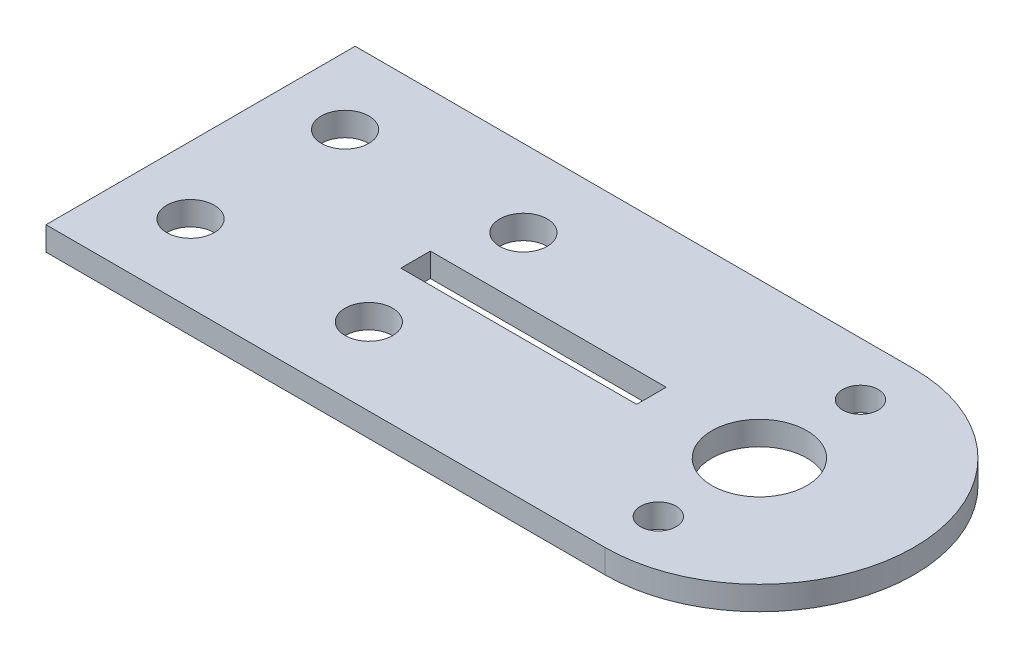
ISO-10303-21;
HEADER;
FILE_DESCRIPTION(('STEP AP214'),'2;1');
FILE_NAME('part.step','',(''),(''),'','','');
FILE_SCHEMA(('AUTOMOTIVE_DESIGN { 1 0 10303 214 1 1 1 1 }'));
ENDSEC;
DATA;
#1=APPLICATION_CONTEXT('core data for automotive mechanical design processes');
#2=APPLICATION_PROTOCOL_DEFINITION('international standard','automotive_design',2000,#1);
#3=PRODUCT_CONTEXT('',#1,'mechanical');
#4=PRODUCT('Part','Part','',(#3));
#5=PRODUCT_RELATED_PRODUCT_CATEGORY('part','',(#4));
#6=PRODUCT_DEFINITION_FORMATION('','',#4);
#7=PRODUCT_DEFINITION_CONTEXT('part definition',#1,'design');
#8=PRODUCT_DEFINITION('design','',#6,#7);
#9=PRODUCT_DEFINITION_SHAPE('','',#8);
#10=(LENGTH_UNIT() NAMED_UNIT(*) SI_UNIT(.MILLI.,.METRE.));
#11=(NAMED_UNIT(*) PLANE_ANGLE_UNIT() SI_UNIT($,.RADIAN.));
#12=(NAMED_UNIT(*) SI_UNIT($,.STERADIAN.) SOLID_ANGLE_UNIT());
#13=UNCERTAINTY_MEASURE_WITH_UNIT(LENGTH_MEASURE(1.E-05),#10,'distance_accuracy_value','');
#14=(GEOMETRIC_REPRESENTATION_CONTEXT(3) GLOBAL_UNCERTAINTY_ASSIGNED_CONTEXT((#13)) GLOBAL_UNIT_ASSIGNED_CONTEXT((#10,
#11,#12)) REPRESENTATION_CONTEXT('',''));
#15=CARTESIAN_POINT('',(0.,0.,0.));
#16=DIRECTION('',(0.,0.,1.));
#17=DIRECTION('',(1.,0.,0.));
#18=AXIS2_PLACEMENT_3D('',#15,#16,#17);
#19=CARTESIAN_POINT('',(17.,2.,0.));
#20=DIRECTION('',(0.,1.,0.));
#21=DIRECTION('',(0.,0.,1.));
#22=AXIS2_PLACEMENT_3D('',#19,#20,#21);
#23=PLANE('',#22);
#24=DIRECTION('',(0.,0.,-1.));
#25=VECTOR('',#24,1.);
#26=CARTESIAN_POINT('',(7.91926010344526,2.,1.24402170207379));
#27=LINE('',#26,#25);
#28=CARTESIAN_POINT('',(7.91926010344526,2.,1.24402170207379));
#29=VERTEX_POINT('',#28);
#30=CARTESIAN_POINT('',(7.91926010344526,2.,-1.24402170207379));
#31=VERTEX_POINT('',#30);
#32=EDGE_CURVE('E49',#29,#31,#27,.T.);
#33=ORIENTED_EDGE('',*,*,#32,.F.);
#34=DIRECTION('',(1.,0.,0.));
#35=VECTOR('',#34,1.);
#36=CARTESIAN_POINT('',(-11.9192601034453,2.,1.24402170207379));
#37=LINE('',#36,#35);
#38=CARTESIAN_POINT('',(-11.9192601034453,2.,1.24402170207379));
#39=VERTEX_POINT('',#38);
#40=EDGE_CURVE('E117',#39,#29,#37,.T.);
#41=ORIENTED_EDGE('',*,*,#40,.F.);
#42=DIRECTION('',(0.,0.,1.));
#43=VECTOR('',#42,1.);
#44=CARTESIAN_POINT('',(-11.9192601034453,2.,1.24402170207379));
#45=LINE('',#44,#43);
#46=CARTESIAN_POINT('',(-11.9192601034453,2.,-1.24402170207379));
#47=VERTEX_POINT('',#46);
#48=EDGE_CURVE('E102',#47,#39,#45,.T.);
#49=ORIENTED_EDGE('',*,*,#48,.F.);
#50=DIRECTION('',(-1.,0.,0.));
#51=VECTOR('',#50,1.);
#52=CARTESIAN_POINT('',(-11.9192601034453,2.,-1.24402170207379));
#53=LINE('',#52,#51);
#54=EDGE_CURVE('E111',#31,#47,#53,.T.);
#55=ORIENTED_EDGE('',*,*,#54,.F.);
#56=EDGE_LOOP('',(#33,#41,#49,#55));
#57=FACE_BOUND('',#56,.T.);
#58=CARTESIAN_POINT('',(17.,2.,-8.5));
#59=DIRECTION('',(0.,1.,0.));
#60=DIRECTION('',(0.,0.,1.));
#61=AXIS2_PLACEMENT_3D('',#58,#59,#60);
#62=CIRCLE('',#61,1.5);
#63=CARTESIAN_POINT('',(17.,2.,-6.99999999999999));
#64=VERTEX_POINT('',#63);
#65=EDGE_CURVE('E133',#64,#64,#62,.T.);
#66=ORIENTED_EDGE('',*,*,#65,.F.);
#67=EDGE_LOOP('',(#66));
#68=FACE_BOUND('',#67,.T.);
#69=CARTESIAN_POINT('',(-24.3464794724316,2.,-6.49999999999999));
#70=DIRECTION('',(0.,1.,0.));
#71=DIRECTION('',(0.,0.,1.));
#72=AXIS2_PLACEMENT_3D('',#69,#70,#71);
#73=CIRCLE('',#72,2.);
#74=CARTESIAN_POINT('',(-24.3464794724316,2.,-4.49999999999999));
#75=VERTEX_POINT('',#74);
#76=EDGE_CURVE('E145',#75,#75,#73,.T.);
#77=ORIENTED_EDGE('',*,*,#76,.F.);
#78=EDGE_LOOP('',(#77));
#79=FACE_BOUND('',#78,.T.);
#80=CARTESIAN_POINT('',(-9.34647947243159,2.,6.5));
#81=DIRECTION('',(0.,1.,0.));
#82=DIRECTION('',(0.,0.,1.));
#83=AXIS2_PLACEMENT_3D('',#80,#81,#82);
#84=CIRCLE('',#83,2.);
#85=CARTESIAN_POINT('',(-9.34647947243159,2.,8.5));
#86=VERTEX_POINT('',#85);
#87=EDGE_CURVE('E157',#86,#86,#84,.T.);
#88=ORIENTED_EDGE('',*,*,#87,.F.);
#89=EDGE_LOOP('',(#88));
#90=FACE_BOUND('',#89,.T.);
#91=CARTESIAN_POINT('',(17.,2.,0.));
#92=DIRECTION('',(0.,1.,0.));
#93=DIRECTION('',(0.,0.,1.));
#94=AXIS2_PLACEMENT_3D('',#91,#92,#93);
#95=CIRCLE('',#94,13.);
#96=CARTESIAN_POINT('',(17.,2.,13.));
#97=VERTEX_POINT('',#96);
#98=CARTESIAN_POINT('',(17.,2.,-13.));
#99=VERTEX_POINT('',#98);
#100=EDGE_CURVE('E169',#97,#99,#95,.T.);
#101=ORIENTED_EDGE('',*,*,#100,.T.);
#102=DIRECTION('',(-1.,0.,0.));
#103=VECTOR('',#102,1.);
#104=CARTESIAN_POINT('',(17.,2.,-13.));
#105=LINE('',#104,#103);
#106=CARTESIAN_POINT('',(-30.,2.,-13.));
#107=VERTEX_POINT('',#106);
#108=EDGE_CURVE('E172',#99,#107,#105,.T.);
#109=ORIENTED_EDGE('',*,*,#108,.T.);
#110=DIRECTION('',(0.,0.,1.));
#111=VECTOR('',#110,1.);
#112=CARTESIAN_POINT('',(-30.,2.,-13.));
#113=LINE('',#112,#111);
#114=CARTESIAN_POINT('',(-30.,2.,13.));
#115=VERTEX_POINT('',#114);
#116=EDGE_CURVE('E175',#107,#115,#113,.T.);
#117=ORIENTED_EDGE('',*,*,#116,.T.);
#118=DIRECTION('',(1.,0.,0.));
#119=VECTOR('',#118,1.);
#120=CARTESIAN_POINT('',(-30.,2.,13.));
#121=LINE('',#120,#119);
#122=EDGE_CURVE('E177',#115,#97,#121,.T.);
#123=ORIENTED_EDGE('',*,*,#122,.T.);
#124=EDGE_LOOP('',(#101,#109,#117,#123));
#125=FACE_BOUND('',#124,.T.);
#126=CARTESIAN_POINT('',(-24.3464794724316,2.,6.5));
#127=DIRECTION('',(0.,1.,0.));
#128=DIRECTION('',(0.,0.,1.));
#129=AXIS2_PLACEMENT_3D('',#126,#127,#128);
#130=CIRCLE('',#129,2.);
#131=CARTESIAN_POINT('',(-24.3464794724316,2.,8.5));
#132=VERTEX_POINT('',#131);
#133=EDGE_CURVE('E163',#132,#132,#130,.T.);
#134=ORIENTED_EDGE('',*,*,#133,.F.);
#135=EDGE_LOOP('',(#134));
#136=FACE_BOUND('',#135,.T.);
#137=CARTESIAN_POINT('',(-9.34647947243159,2.,-6.49999999999999));
#138=DIRECTION('',(0.,1.,0.));
#139=DIRECTION('',(0.,0.,1.));
#140=AXIS2_PLACEMENT_3D('',#137,#138,#139);
#141=CIRCLE('',#140,2.);
#142=CARTESIAN_POINT('',(-9.34647947243159,2.,-4.49999999999999));
#143=VERTEX_POINT('',#142);
#144=EDGE_CURVE('E151',#143,#143,#141,.T.);
#145=ORIENTED_EDGE('',*,*,#144,.F.);
#146=EDGE_LOOP('',(#145));
#147=FACE_BOUND('',#146,.T.);
#148=CARTESIAN_POINT('',(17.,2.,8.5));
#149=DIRECTION('',(0.,1.,0.));
#150=DIRECTION('',(0.,0.,1.));
#151=AXIS2_PLACEMENT_3D('',#148,#149,#150);
#152=CIRCLE('',#151,1.5);
#153=CARTESIAN_POINT('',(17.,2.,10.));
#154=VERTEX_POINT('',#153);
#155=EDGE_CURVE('E139',#154,#154,#152,.T.);
#156=ORIENTED_EDGE('',*,*,#155,.F.);
#157=EDGE_LOOP('',(#156));
#158=FACE_BOUND('',#157,.T.);
#159=CARTESIAN_POINT('',(17.,2.,0.));
#160=DIRECTION('',(0.,1.,0.));
#161=DIRECTION('',(0.,0.,1.));
#162=AXIS2_PLACEMENT_3D('',#159,#160,#161);
#163=CIRCLE('',#162,4.);
#164=CARTESIAN_POINT('',(17.,2.,4.));
#165=VERTEX_POINT('',#164);
#166=EDGE_CURVE('E127',#165,#165,#163,.T.);
#167=ORIENTED_EDGE('',*,*,#166,.F.);
#168=EDGE_LOOP('',(#167));
#169=FACE_BOUND('',#168,.T.);
#170=ADVANCED_FACE('F34',(#57,#68,#79,#90,#125,#136,#147,#158,#169),#23,.T.);
#171=CARTESIAN_POINT('',(17.,0.,0.));
#172=DIRECTION('',(0.,1.,0.));
#173=DIRECTION('',(0.,0.,1.));
#174=AXIS2_PLACEMENT_3D('',#171,#172,#173);
#175=PLANE('',#174);
#176=DIRECTION('',(1.,0.,0.));
#177=VECTOR('',#176,1.);
#178=CARTESIAN_POINT('',(17.,0.,1.24402170207379));
#179=LINE('',#178,#177);
#180=CARTESIAN_POINT('',(-11.9192601034453,0.,1.24402170207379));
#181=VERTEX_POINT('',#180);
#182=CARTESIAN_POINT('',(7.91926010344526,0.,1.24402170207379));
#183=VERTEX_POINT('',#182);
#184=EDGE_CURVE('E42',#181,#183,#179,.T.);
#185=ORIENTED_EDGE('',*,*,#184,.T.);
#186=DIRECTION('',(0.,0.,-1.));
#187=VECTOR('',#186,1.);
#188=CARTESIAN_POINT('',(7.91926010344526,0.,0.));
#189=LINE('',#188,#187);
#190=CARTESIAN_POINT('',(7.91926010344526,0.,-1.24402170207379));
#191=VERTEX_POINT('',#190);
#192=EDGE_CURVE('E11',#183,#191,#189,.T.);
#193=ORIENTED_EDGE('',*,*,#192,.T.);
#194=DIRECTION('',(-1.,0.,0.));
#195=VECTOR('',#194,1.);
#196=CARTESIAN_POINT('',(17.,0.,-1.24402170207379));
#197=LINE('',#196,#195);
#198=CARTESIAN_POINT('',(-11.9192601034453,0.,-1.24402170207379));
#199=VERTEX_POINT('',#198);
#200=EDGE_CURVE('E198',#191,#199,#197,.T.);
#201=ORIENTED_EDGE('',*,*,#200,.T.);
#202=DIRECTION('',(0.,0.,1.));
#203=VECTOR('',#202,1.);
#204=CARTESIAN_POINT('',(-11.9192601034453,0.,0.));
#205=LINE('',#204,#203);
#206=EDGE_CURVE('E105',#199,#181,#205,.T.);
#207=ORIENTED_EDGE('',*,*,#206,.T.);
#208=EDGE_LOOP('',(#185,#193,#201,#207));
#209=FACE_BOUND('',#208,.T.);
#210=CARTESIAN_POINT('',(17.,0.,0.));
#211=DIRECTION('',(0.,1.,0.));
#212=DIRECTION('',(0.,0.,1.));
#213=AXIS2_PLACEMENT_3D('',#210,#211,#212);
#214=CIRCLE('',#213,13.);
#215=CARTESIAN_POINT('',(17.,0.,13.));
#216=VERTEX_POINT('',#215);
#217=CARTESIAN_POINT('',(17.,0.,-13.));
#218=VERTEX_POINT('',#217);
#219=EDGE_CURVE('E166',#216,#218,#214,.T.);
#220=ORIENTED_EDGE('',*,*,#219,.F.);
#221=DIRECTION('',(1.,0.,0.));
#222=VECTOR('',#221,1.);
#223=CARTESIAN_POINT('',(-30.,0.,13.));
#224=LINE('',#223,#222);
#225=CARTESIAN_POINT('',(-30.,0.,13.));
#226=VERTEX_POINT('',#225);
#227=EDGE_CURVE('E173',#226,#216,#224,.T.);
#228=ORIENTED_EDGE('',*,*,#227,.F.);
#229=DIRECTION('',(0.,0.,1.));
#230=VECTOR('',#229,1.);
#231=CARTESIAN_POINT('',(-30.,0.,-13.));
#232=LINE('',#231,#230);
#233=CARTESIAN_POINT('',(-30.,0.,-13.));
#234=VERTEX_POINT('',#233);
#235=EDGE_CURVE('E184',#234,#226,#232,.T.);
#236=ORIENTED_EDGE('',*,*,#235,.F.);
#237=DIRECTION('',(-1.,0.,0.));
#238=VECTOR('',#237,1.);
#239=CARTESIAN_POINT('',(17.,0.,-13.));
#240=LINE('',#239,#238);
#241=EDGE_CURVE('E182',#218,#234,#240,.T.);
#242=ORIENTED_EDGE('',*,*,#241,.F.);
#243=EDGE_LOOP('',(#220,#228,#236,#242));
#244=FACE_BOUND('',#243,.T.);
#245=CARTESIAN_POINT('',(-24.3464794724316,0.,6.5));
#246=DIRECTION('',(0.,1.,0.));
#247=DIRECTION('',(0.,0.,1.));
#248=AXIS2_PLACEMENT_3D('',#245,#246,#247);
#249=CIRCLE('',#248,2.);
#250=CARTESIAN_POINT('',(-24.3464794724316,0.,8.5));
#251=VERTEX_POINT('',#250);
#252=EDGE_CURVE('E160',#251,#251,#249,.T.);
#253=ORIENTED_EDGE('',*,*,#252,.T.);
#254=EDGE_LOOP('',(#253));
#255=FACE_BOUND('',#254,.T.);
#256=CARTESIAN_POINT('',(-9.34647947243159,0.,6.5));
#257=DIRECTION('',(0.,1.,0.));
#258=DIRECTION('',(0.,0.,1.));
#259=AXIS2_PLACEMENT_3D('',#256,#257,#258);
#260=CIRCLE('',#259,2.);
#261=CARTESIAN_POINT('',(-9.34647947243159,0.,8.5));
#262=VERTEX_POINT('',#261);
#263=EDGE_CURVE('E154',#262,#262,#260,.T.);
#264=ORIENTED_EDGE('',*,*,#263,.T.);
#265=EDGE_LOOP('',(#264));
#266=FACE_BOUND('',#265,.T.);
#267=CARTESIAN_POINT('',(-9.34647947243159,0.,-6.49999999999999));
#268=DIRECTION('',(0.,1.,0.));
#269=DIRECTION('',(0.,0.,1.));
#270=AXIS2_PLACEMENT_3D('',#267,#268,#269);
#271=CIRCLE('',#270,2.);
#272=CARTESIAN_POINT('',(-9.34647947243159,0.,-4.49999999999999));
#273=VERTEX_POINT('',#272);
#274=EDGE_CURVE('E148',#273,#273,#271,.T.);
#275=ORIENTED_EDGE('',*,*,#274,.T.);
#276=EDGE_LOOP('',(#275));
#277=FACE_BOUND('',#276,.T.);
#278=CARTESIAN_POINT('',(-24.3464794724316,0.,-6.49999999999999));
#279=DIRECTION('',(0.,1.,0.));
#280=DIRECTION('',(0.,0.,1.));
#281=AXIS2_PLACEMENT_3D('',#278,#279,#280);
#282=CIRCLE('',#281,2.);
#283=CARTESIAN_POINT('',(-24.3464794724316,0.,-4.49999999999999));
#284=VERTEX_POINT('',#283);
#285=EDGE_CURVE('E142',#284,#284,#282,.T.);
#286=ORIENTED_EDGE('',*,*,#285,.T.);
#287=EDGE_LOOP('',(#286));
#288=FACE_BOUND('',#287,.T.);
#289=CARTESIAN_POINT('',(17.,0.,8.5));
#290=DIRECTION('',(0.,1.,0.));
#291=DIRECTION('',(0.,0.,1.));
#292=AXIS2_PLACEMENT_3D('',#289,#290,#291);
#293=CIRCLE('',#292,1.5);
#294=CARTESIAN_POINT('',(17.,0.,10.));
#295=VERTEX_POINT('',#294);
#296=EDGE_CURVE('E136',#295,#295,#293,.T.);
#297=ORIENTED_EDGE('',*,*,#296,.T.);
#298=EDGE_LOOP('',(#297));
#299=FACE_BOUND('',#298,.T.);
#300=CARTESIAN_POINT('',(17.,0.,-8.5));
#301=DIRECTION('',(0.,1.,0.));
#302=DIRECTION('',(0.,0.,1.));
#303=AXIS2_PLACEMENT_3D('',#300,#301,#302);
#304=CIRCLE('',#303,1.5);
#305=CARTESIAN_POINT('',(17.,0.,-6.99999999999999));
#306=VERTEX_POINT('',#305);
#307=EDGE_CURVE('E130',#306,#306,#304,.T.);
#308=ORIENTED_EDGE('',*,*,#307,.T.);
#309=EDGE_LOOP('',(#308));
#310=FACE_BOUND('',#309,.T.);
#311=CARTESIAN_POINT('',(17.,0.,0.));
#312=DIRECTION('',(0.,1.,0.));
#313=DIRECTION('',(0.,0.,1.));
#314=AXIS2_PLACEMENT_3D('',#311,#312,#313);
#315=CIRCLE('',#314,4.);
#316=CARTESIAN_POINT('',(17.,0.,4.));
#317=VERTEX_POINT('',#316);
#318=EDGE_CURVE('E124',#317,#317,#315,.T.);
#319=ORIENTED_EDGE('',*,*,#318,.T.);
#320=EDGE_LOOP('',(#319));
#321=FACE_BOUND('',#320,.T.);
#322=ADVANCED_FACE('F202',(#209,#244,#255,#266,#277,#288,#299,#310,#321),#175,.F.);
#323=CARTESIAN_POINT('',(17.,2.,0.));
#324=DIRECTION('',(0.,-1.,0.));
#325=DIRECTION('',(0.,0.,-1.));
#326=AXIS2_PLACEMENT_3D('',#323,#324,#325);
#327=CYLINDRICAL_SURFACE('',#326,13.);
#328=ORIENTED_EDGE('',*,*,#219,.T.);
#329=DIRECTION('',(0.,-1.,0.));
#330=VECTOR('',#329,1.);
#331=CARTESIAN_POINT('',(17.,2.,-13.));
#332=LINE('',#331,#330);
#333=EDGE_CURVE('E195',#99,#218,#332,.T.);
#334=ORIENTED_EDGE('',*,*,#333,.F.);
#335=ORIENTED_EDGE('',*,*,#100,.F.);
#336=DIRECTION('',(0.,-1.,0.));
#337=VECTOR('',#336,1.);
#338=CARTESIAN_POINT('',(17.,2.,13.));
#339=LINE('',#338,#337);
#340=EDGE_CURVE('E179',#97,#216,#339,.T.);
#341=ORIENTED_EDGE('',*,*,#340,.T.);
#342=EDGE_LOOP('',(#328,#334,#335,#341));
#343=FACE_BOUND('',#342,.T.);
#344=ADVANCED_FACE('F36',(#343),#327,.T.);
#345=CARTESIAN_POINT('',(17.,2.,-13.));
#346=DIRECTION('',(0.,0.,1.));
#347=DIRECTION('',(1.,0.,0.));
#348=AXIS2_PLACEMENT_3D('',#345,#346,#347);
#349=PLANE('',#348);
#350=ORIENTED_EDGE('',*,*,#241,.T.);
#351=DIRECTION('',(0.,-1.,0.));
#352=VECTOR('',#351,1.);
#353=CARTESIAN_POINT('',(-30.,2.,-13.));
#354=LINE('',#353,#352);
#355=EDGE_CURVE('E192',#107,#234,#354,.T.);
#356=ORIENTED_EDGE('',*,*,#355,.F.);
#357=ORIENTED_EDGE('',*,*,#108,.F.);
#358=ORIENTED_EDGE('',*,*,#333,.T.);
#359=EDGE_LOOP('',(#350,#356,#357,#358));
#360=FACE_BOUND('',#359,.T.);
#361=ADVANCED_FACE('F236',(#360),#349,.F.);
#362=CARTESIAN_POINT('',(-30.,2.,-13.));
#363=DIRECTION('',(1.,0.,0.));
#364=DIRECTION('',(0.,0.,-1.));
#365=AXIS2_PLACEMENT_3D('',#362,#363,#364);
#366=PLANE('',#365);
#367=ORIENTED_EDGE('',*,*,#235,.T.);
#368=DIRECTION('',(0.,-1.,0.));
#369=VECTOR('',#368,1.);
#370=CARTESIAN_POINT('',(-30.,2.,13.));
#371=LINE('',#370,#369);
#372=EDGE_CURVE('E189',#115,#226,#371,.T.);
#373=ORIENTED_EDGE('',*,*,#372,.F.);
#374=ORIENTED_EDGE('',*,*,#116,.F.);
#375=ORIENTED_EDGE('',*,*,#355,.T.);
#376=EDGE_LOOP('',(#367,#373,#374,#375));
#377=FACE_BOUND('',#376,.T.);
#378=ADVANCED_FACE('F233',(#377),#366,.F.);
#379=CARTESIAN_POINT('',(-30.,2.,13.));
#380=DIRECTION('',(0.,0.,-1.));
#381=DIRECTION('',(-1.,0.,0.));
#382=AXIS2_PLACEMENT_3D('',#379,#380,#381);
#383=PLANE('',#382);
#384=ORIENTED_EDGE('',*,*,#227,.T.);
#385=ORIENTED_EDGE('',*,*,#340,.F.);
#386=ORIENTED_EDGE('',*,*,#122,.F.);
#387=ORIENTED_EDGE('',*,*,#372,.T.);
#388=EDGE_LOOP('',(#384,#385,#386,#387));
#389=FACE_BOUND('',#388,.T.);
#390=ADVANCED_FACE('F230',(#389),#383,.F.);
#391=CARTESIAN_POINT('',(-24.3464794724316,2.,6.5));
#392=DIRECTION('',(0.,-1.,0.));
#393=DIRECTION('',(0.,0.,-1.));
#394=AXIS2_PLACEMENT_3D('',#391,#392,#393);
#395=CYLINDRICAL_SURFACE('',#394,2.);
#396=ORIENTED_EDGE('',*,*,#133,.T.);
#397=EDGE_LOOP('',(#396));
#398=FACE_BOUND('',#397,.T.);
#399=ORIENTED_EDGE('',*,*,#252,.F.);
#400=EDGE_LOOP('',(#399));
#401=FACE_BOUND('',#400,.T.);
#402=ADVANCED_FACE('F227',(#398,#401),#395,.F.);
#403=CARTESIAN_POINT('',(-9.34647947243159,2.,6.5));
#404=DIRECTION('',(0.,-1.,0.));
#405=DIRECTION('',(0.,0.,-1.));
#406=AXIS2_PLACEMENT_3D('',#403,#404,#405);
#407=CYLINDRICAL_SURFACE('',#406,2.);
#408=ORIENTED_EDGE('',*,*,#87,.T.);
#409=EDGE_LOOP('',(#408));
#410=FACE_BOUND('',#409,.T.);
#411=ORIENTED_EDGE('',*,*,#263,.F.);
#412=EDGE_LOOP('',(#411));
#413=FACE_BOUND('',#412,.T.);
#414=ADVANCED_FACE('F289',(#410,#413),#407,.F.);
#415=CARTESIAN_POINT('',(-9.34647947243159,2.,-6.49999999999999));
#416=DIRECTION('',(0.,-1.,0.));
#417=DIRECTION('',(0.,0.,-1.));
#418=AXIS2_PLACEMENT_3D('',#415,#416,#417);
#419=CYLINDRICAL_SURFACE('',#418,2.);
#420=ORIENTED_EDGE('',*,*,#144,.T.);
#421=EDGE_LOOP('',(#420));
#422=FACE_BOUND('',#421,.T.);
#423=ORIENTED_EDGE('',*,*,#274,.F.);
#424=EDGE_LOOP('',(#423));
#425=FACE_BOUND('',#424,.T.);
#426=ADVANCED_FACE('F286',(#422,#425),#419,.F.);
#427=CARTESIAN_POINT('',(-24.3464794724316,2.,-6.49999999999999));
#428=DIRECTION('',(0.,-1.,0.));
#429=DIRECTION('',(0.,0.,-1.));
#430=AXIS2_PLACEMENT_3D('',#427,#428,#429);
#431=CYLINDRICAL_SURFACE('',#430,2.);
#432=ORIENTED_EDGE('',*,*,#76,.T.);
#433=EDGE_LOOP('',(#432));
#434=FACE_BOUND('',#433,.T.);
#435=ORIENTED_EDGE('',*,*,#285,.F.);
#436=EDGE_LOOP('',(#435));
#437=FACE_BOUND('',#436,.T.);
#438=ADVANCED_FACE('F271',(#434,#437),#431,.F.);
#439=CARTESIAN_POINT('',(17.,2.,8.5));
#440=DIRECTION('',(0.,-1.,0.));
#441=DIRECTION('',(0.,0.,-1.));
#442=AXIS2_PLACEMENT_3D('',#439,#440,#441);
#443=CYLINDRICAL_SURFACE('',#442,1.5);
#444=ORIENTED_EDGE('',*,*,#155,.T.);
#445=EDGE_LOOP('',(#444));
#446=FACE_BOUND('',#445,.T.);
#447=ORIENTED_EDGE('',*,*,#296,.F.);
#448=EDGE_LOOP('',(#447));
#449=FACE_BOUND('',#448,.T.);
#450=ADVANCED_FACE('F268',(#446,#449),#443,.F.);
#451=CARTESIAN_POINT('',(17.,2.,-8.5));
#452=DIRECTION('',(0.,-1.,0.));
#453=DIRECTION('',(0.,0.,-1.));
#454=AXIS2_PLACEMENT_3D('',#451,#452,#453);
#455=CYLINDRICAL_SURFACE('',#454,1.5);
#456=ORIENTED_EDGE('',*,*,#65,.T.);
#457=EDGE_LOOP('',(#456));
#458=FACE_BOUND('',#457,.T.);
#459=ORIENTED_EDGE('',*,*,#307,.F.);
#460=EDGE_LOOP('',(#459));
#461=FACE_BOUND('',#460,.T.);
#462=ADVANCED_FACE('F216',(#458,#461),#455,.F.);
#463=CARTESIAN_POINT('',(17.,2.,0.));
#464=DIRECTION('',(0.,-1.,0.));
#465=DIRECTION('',(0.,0.,-1.));
#466=AXIS2_PLACEMENT_3D('',#463,#464,#465);
#467=CYLINDRICAL_SURFACE('',#466,4.);
#468=ORIENTED_EDGE('',*,*,#166,.T.);
#469=EDGE_LOOP('',(#468));
#470=FACE_BOUND('',#469,.T.);
#471=ORIENTED_EDGE('',*,*,#318,.F.);
#472=EDGE_LOOP('',(#471));
#473=FACE_BOUND('',#472,.T.);
#474=ADVANCED_FACE('F209',(#470,#473),#467,.F.);
#475=CARTESIAN_POINT('',(7.91926010344526,-48.,1.24402170207379));
#476=DIRECTION('',(1.,0.,0.));
#477=DIRECTION('',(0.,0.,-1.));
#478=AXIS2_PLACEMENT_3D('',#475,#476,#477);
#479=PLANE('',#478);
#480=DIRECTION('',(0.,1.,0.));
#481=VECTOR('',#480,1.);
#482=CARTESIAN_POINT('',(7.91926010344526,-48.,1.24402170207379));
#483=LINE('',#482,#481);
#484=EDGE_CURVE('E122',#183,#29,#483,.T.);
#485=ORIENTED_EDGE('',*,*,#484,.T.);
#486=ORIENTED_EDGE('',*,*,#32,.T.);
#487=DIRECTION('',(0.,1.,0.));
#488=VECTOR('',#487,1.);
#489=CARTESIAN_POINT('',(7.91926010344526,-48.,-1.24402170207379));
#490=LINE('',#489,#488);
#491=EDGE_CURVE('E108',#191,#31,#490,.T.);
#492=ORIENTED_EDGE('',*,*,#491,.F.);
#493=ORIENTED_EDGE('',*,*,#192,.F.);
#494=EDGE_LOOP('',(#485,#486,#492,#493));
#495=FACE_BOUND('',#494,.T.);
#496=ADVANCED_FACE('F207',(#495),#479,.F.);
#497=CARTESIAN_POINT('',(-11.9192601034453,-48.,1.24402170207379));
#498=DIRECTION('',(0.,0.,1.));
#499=DIRECTION('',(1.,0.,0.));
#500=AXIS2_PLACEMENT_3D('',#497,#498,#499);
#501=PLANE('',#500);
#502=DIRECTION('',(0.,1.,0.));
#503=VECTOR('',#502,1.);
#504=CARTESIAN_POINT('',(-11.9192601034453,-48.,1.24402170207379));
#505=LINE('',#504,#503);
#506=EDGE_CURVE('E107',#181,#39,#505,.T.);
#507=ORIENTED_EDGE('',*,*,#506,.T.);
#508=ORIENTED_EDGE('',*,*,#40,.T.);
#509=ORIENTED_EDGE('',*,*,#484,.F.);
#510=ORIENTED_EDGE('',*,*,#184,.F.);
#511=EDGE_LOOP('',(#507,#508,#509,#510));
#512=FACE_BOUND('',#511,.T.);
#513=ADVANCED_FACE('F206',(#512),#501,.F.);
#514=CARTESIAN_POINT('',(-11.9192601034453,-48.,1.24402170207379));
#515=DIRECTION('',(-1.,0.,0.));
#516=DIRECTION('',(0.,0.,1.));
#517=AXIS2_PLACEMENT_3D('',#514,#515,#516);
#518=PLANE('',#517);
#519=DIRECTION('',(0.,1.,0.));
#520=VECTOR('',#519,1.);
#521=CARTESIAN_POINT('',(-11.9192601034453,-48.,-1.24402170207379));
#522=LINE('',#521,#520);
#523=EDGE_CURVE('E57',#199,#47,#522,.T.);
#524=ORIENTED_EDGE('',*,*,#523,.T.);
#525=ORIENTED_EDGE('',*,*,#48,.T.);
#526=ORIENTED_EDGE('',*,*,#506,.F.);
#527=ORIENTED_EDGE('',*,*,#206,.F.);
#528=EDGE_LOOP('',(#524,#525,#526,#527));
#529=FACE_BOUND('',#528,.T.);
#530=ADVANCED_FACE('F99',(#529),#518,.F.);
#531=CARTESIAN_POINT('',(-11.9192601034453,-48.,-1.24402170207379));
#532=DIRECTION('',(0.,0.,-1.));
#533=DIRECTION('',(-1.,0.,0.));
#534=AXIS2_PLACEMENT_3D('',#531,#532,#533);
#535=PLANE('',#534);
#536=ORIENTED_EDGE('',*,*,#491,.T.);
#537=ORIENTED_EDGE('',*,*,#54,.T.);
#538=ORIENTED_EDGE('',*,*,#523,.F.);
#539=ORIENTED_EDGE('',*,*,#200,.F.);
#540=EDGE_LOOP('',(#536,#537,#538,#539));
#541=FACE_BOUND('',#540,.T.);
#542=ADVANCED_FACE('F112',(#541),#535,.F.);
#543=CLOSED_SHELL('',(#170,#322,#344,#361,#378,#390,#402,#414,#426,#438,#450,#462,#474,#496,
#513,#530,#542));
#544=MANIFOLD_SOLID_BREP('B2',#543);
#545=ADVANCED_BREP_SHAPE_REPRESENTATION('',(#18,#544),#14);
#546=SHAPE_DEFINITION_REPRESENTATION(#9,#545);
ENDSEC;
END-ISO-10303-21;
